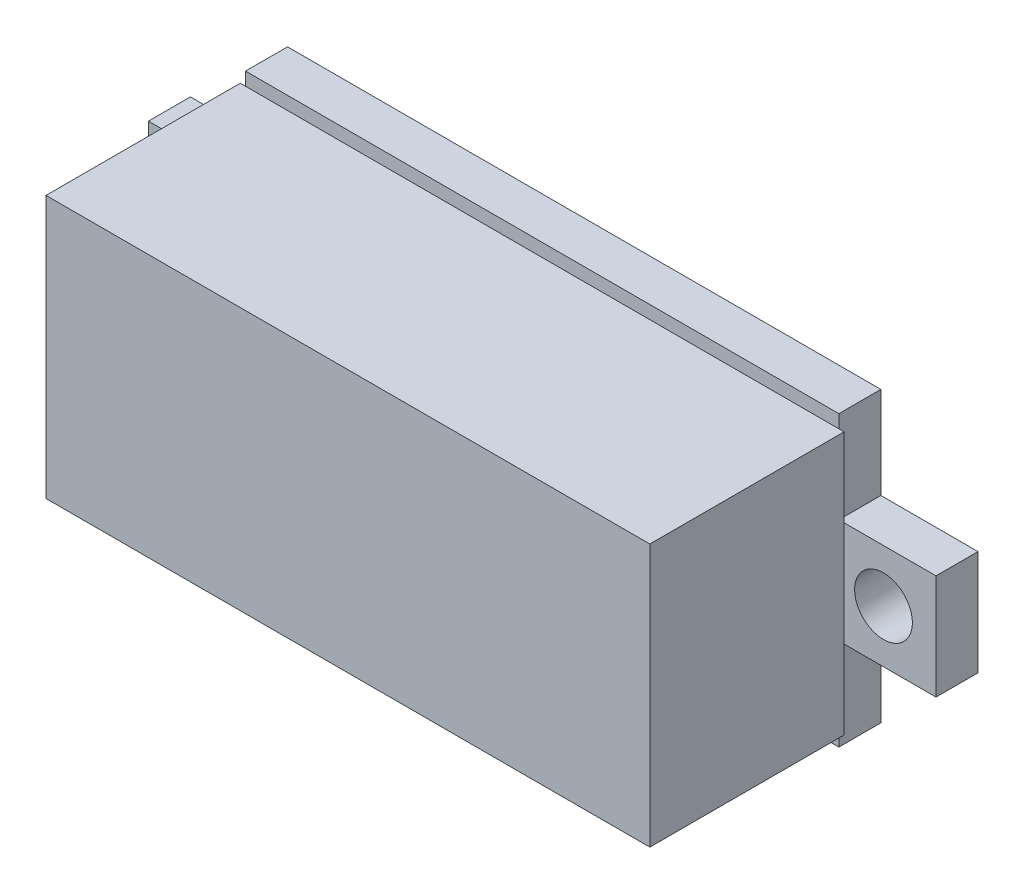
ISO-10303-21;
HEADER;
FILE_DESCRIPTION(('STEP AP214'),'2;1');
FILE_NAME('part.step','',(''),(''),'','','');
FILE_SCHEMA(('AUTOMOTIVE_DESIGN { 1 0 10303 214 1 1 1 1 }'));
ENDSEC;
DATA;
#1=APPLICATION_CONTEXT('core data for automotive mechanical design processes');
#2=APPLICATION_PROTOCOL_DEFINITION('international standard','automotive_design',2000,#1);
#3=PRODUCT_CONTEXT('',#1,'mechanical');
#4=PRODUCT('Part','Part','',(#3));
#5=PRODUCT_RELATED_PRODUCT_CATEGORY('part','',(#4));
#6=PRODUCT_DEFINITION_FORMATION('','',#4);
#7=PRODUCT_DEFINITION_CONTEXT('part definition',#1,'design');
#8=PRODUCT_DEFINITION('design','',#6,#7);
#9=PRODUCT_DEFINITION_SHAPE('','',#8);
#10=(LENGTH_UNIT() NAMED_UNIT(*) SI_UNIT(.MILLI.,.METRE.));
#11=(NAMED_UNIT(*) PLANE_ANGLE_UNIT() SI_UNIT($,.RADIAN.));
#12=(NAMED_UNIT(*) SI_UNIT($,.STERADIAN.) SOLID_ANGLE_UNIT());
#13=UNCERTAINTY_MEASURE_WITH_UNIT(LENGTH_MEASURE(1.E-05),#10,'distance_accuracy_value','');
#14=(GEOMETRIC_REPRESENTATION_CONTEXT(3) GLOBAL_UNCERTAINTY_ASSIGNED_CONTEXT((#13)) GLOBAL_UNIT_ASSIGNED_CONTEXT((#10,
#11,#12)) REPRESENTATION_CONTEXT('',''));
#15=CARTESIAN_POINT('',(0.,0.,0.));
#16=DIRECTION('',(0.,0.,1.));
#17=DIRECTION('',(1.,0.,0.));
#18=AXIS2_PLACEMENT_3D('',#15,#16,#17);
#19=CARTESIAN_POINT('',(0.,0.,0.));
#20=DIRECTION('',(0.,0.,1.));
#21=DIRECTION('',(1.,0.,0.));
#22=AXIS2_PLACEMENT_3D('',#19,#20,#21);
#23=PLANE('',#22);
#24=DIRECTION('',(0.,-1.,0.));
#25=VECTOR('',#24,1.);
#26=CARTESIAN_POINT('',(11.3,-2.,0.));
#27=LINE('',#26,#25);
#28=CARTESIAN_POINT('',(11.3,-2.,0.));
#29=VERTEX_POINT('',#28);
#30=CARTESIAN_POINT('',(11.3,-5.,0.));
#31=VERTEX_POINT('',#30);
#32=EDGE_CURVE('E58',#29,#31,#27,.T.);
#33=ORIENTED_EDGE('',*,*,#32,.F.);
#34=DIRECTION('',(-1.,0.,0.));
#35=VECTOR('',#34,1.);
#36=CARTESIAN_POINT('',(11.3,-2.,0.));
#37=LINE('',#36,#35);
#38=CARTESIAN_POINT('',(11.5,-2.,0.));
#39=VERTEX_POINT('',#38);
#40=EDGE_CURVE('E11',#39,#29,#37,.T.);
#41=ORIENTED_EDGE('',*,*,#40,.F.);
#42=DIRECTION('',(0.,1.,0.));
#43=VECTOR('',#42,1.);
#44=CARTESIAN_POINT('',(11.5,5.,0.));
#45=LINE('',#44,#43);
#46=CARTESIAN_POINT('',(11.5,-5.,0.));
#47=VERTEX_POINT('',#46);
#48=EDGE_CURVE('E215',#47,#39,#45,.T.);
#49=ORIENTED_EDGE('',*,*,#48,.F.);
#50=DIRECTION('',(1.,0.,0.));
#51=VECTOR('',#50,1.);
#52=CARTESIAN_POINT('',(-11.5,-5.,0.));
#53=LINE('',#52,#51);
#54=EDGE_CURVE('E248',#31,#47,#53,.T.);
#55=ORIENTED_EDGE('',*,*,#54,.F.);
#56=EDGE_LOOP('',(#33,#41,#49,#55));
#57=FACE_BOUND('',#56,.T.);
#58=ADVANCED_FACE('F39',(#57),#23,.F.);
#59=DIRECTION('',(1.,0.,0.));
#60=VECTOR('',#59,1.);
#61=CARTESIAN_POINT('',(11.3,2.,0.));
#62=LINE('',#61,#60);
#63=CARTESIAN_POINT('',(11.3,2.,0.));
#64=VERTEX_POINT('',#63);
#65=CARTESIAN_POINT('',(11.5,2.,0.));
#66=VERTEX_POINT('',#65);
#67=EDGE_CURVE('E65',#64,#66,#62,.T.);
#68=ORIENTED_EDGE('',*,*,#67,.F.);
#69=DIRECTION('',(0.,-1.,0.));
#70=VECTOR('',#69,1.);
#71=CARTESIAN_POINT('',(11.3,5.5,0.));
#72=LINE('',#71,#70);
#73=CARTESIAN_POINT('',(11.3,5.,0.));
#74=VERTEX_POINT('',#73);
#75=EDGE_CURVE('E49',#74,#64,#72,.T.);
#76=ORIENTED_EDGE('',*,*,#75,.F.);
#77=DIRECTION('',(-1.,0.,0.));
#78=VECTOR('',#77,1.);
#79=CARTESIAN_POINT('',(-11.5,5.,0.));
#80=LINE('',#79,#78);
#81=CARTESIAN_POINT('',(11.5,5.,0.));
#82=VERTEX_POINT('',#81);
#83=EDGE_CURVE('E238',#82,#74,#80,.T.);
#84=ORIENTED_EDGE('',*,*,#83,.F.);
#85=EDGE_CURVE('E209',#66,#82,#45,.T.);
#86=ORIENTED_EDGE('',*,*,#85,.F.);
#87=EDGE_LOOP('',(#68,#76,#84,#86));
#88=FACE_BOUND('',#87,.T.);
#89=ADVANCED_FACE('F487',(#88),#23,.F.);
#90=DIRECTION('',(0.,1.,0.));
#91=VECTOR('',#90,1.);
#92=CARTESIAN_POINT('',(-11.3,5.5,0.));
#93=LINE('',#92,#91);
#94=CARTESIAN_POINT('',(-11.3,2.,0.));
#95=VERTEX_POINT('',#94);
#96=CARTESIAN_POINT('',(-11.3,5.,0.));
#97=VERTEX_POINT('',#96);
#98=EDGE_CURVE('E385',#95,#97,#93,.T.);
#99=ORIENTED_EDGE('',*,*,#98,.F.);
#100=DIRECTION('',(1.,0.,0.));
#101=VECTOR('',#100,1.);
#102=CARTESIAN_POINT('',(-15.,2.,0.));
#103=LINE('',#102,#101);
#104=CARTESIAN_POINT('',(-11.5,2.,0.));
#105=VERTEX_POINT('',#104);
#106=EDGE_CURVE('E272',#105,#95,#103,.T.);
#107=ORIENTED_EDGE('',*,*,#106,.F.);
#108=DIRECTION('',(0.,-1.,0.));
#109=VECTOR('',#108,1.);
#110=CARTESIAN_POINT('',(-11.5,5.,0.));
#111=LINE('',#110,#109);
#112=CARTESIAN_POINT('',(-11.5,5.,0.));
#113=VERTEX_POINT('',#112);
#114=EDGE_CURVE('E244',#113,#105,#111,.T.);
#115=ORIENTED_EDGE('',*,*,#114,.F.);
#116=EDGE_CURVE('E237',#97,#113,#80,.T.);
#117=ORIENTED_EDGE('',*,*,#116,.F.);
#118=EDGE_LOOP('',(#99,#107,#115,#117));
#119=FACE_BOUND('',#118,.T.);
#120=ADVANCED_FACE('F492',(#119),#23,.F.);
#121=DIRECTION('',(0.,1.,0.));
#122=VECTOR('',#121,1.);
#123=CARTESIAN_POINT('',(-11.3,-1.99999999999999,0.));
#124=LINE('',#123,#122);
#125=CARTESIAN_POINT('',(-11.3,-5.,0.));
#126=VERTEX_POINT('',#125);
#127=CARTESIAN_POINT('',(-11.3,-1.99999999999999,0.));
#128=VERTEX_POINT('',#127);
#129=EDGE_CURVE('E207',#126,#128,#124,.T.);
#130=ORIENTED_EDGE('',*,*,#129,.F.);
#131=CARTESIAN_POINT('',(-11.5,-5.,0.));
#132=VERTEX_POINT('',#131);
#133=EDGE_CURVE('E225',#132,#126,#53,.T.);
#134=ORIENTED_EDGE('',*,*,#133,.F.);
#135=CARTESIAN_POINT('',(-11.5,-1.99999999999999,0.));
#136=VERTEX_POINT('',#135);
#137=EDGE_CURVE('E242',#136,#132,#111,.T.);
#138=ORIENTED_EDGE('',*,*,#137,.F.);
#139=DIRECTION('',(-1.,0.,0.));
#140=VECTOR('',#139,1.);
#141=CARTESIAN_POINT('',(-15.,-2.,0.));
#142=LINE('',#141,#140);
#143=EDGE_CURVE('E287',#128,#136,#142,.T.);
#144=ORIENTED_EDGE('',*,*,#143,.F.);
#145=EDGE_LOOP('',(#130,#134,#138,#144));
#146=FACE_BOUND('',#145,.T.);
#147=ADVANCED_FACE('F456',(#146),#23,.F.);
#148=CARTESIAN_POINT('',(11.5,5.,7.4));
#149=DIRECTION('',(-1.,0.,0.));
#150=DIRECTION('',(0.,-1.,0.));
#151=AXIS2_PLACEMENT_3D('',#148,#149,#150);
#152=PLANE('',#151);
#153=ORIENTED_EDGE('',*,*,#48,.T.);
#154=EDGE_CURVE('E213',#39,#66,#45,.T.);
#155=ORIENTED_EDGE('',*,*,#154,.T.);
#156=ORIENTED_EDGE('',*,*,#85,.T.);
#157=DIRECTION('',(0.,0.,-1.));
#158=VECTOR('',#157,1.);
#159=CARTESIAN_POINT('',(11.5,5.,7.4));
#160=LINE('',#159,#158);
#161=CARTESIAN_POINT('',(11.5,5.,7.4));
#162=VERTEX_POINT('',#161);
#163=EDGE_CURVE('E43',#162,#82,#160,.T.);
#164=ORIENTED_EDGE('',*,*,#163,.F.);
#165=DIRECTION('',(0.,1.,0.));
#166=VECTOR('',#165,1.);
#167=CARTESIAN_POINT('',(11.5,5.,7.4));
#168=LINE('',#167,#166);
#169=CARTESIAN_POINT('',(11.5,-5.,7.4));
#170=VERTEX_POINT('',#169);
#171=EDGE_CURVE('E220',#170,#162,#168,.T.);
#172=ORIENTED_EDGE('',*,*,#171,.F.);
#173=DIRECTION('',(0.,0.,-1.));
#174=VECTOR('',#173,1.);
#175=CARTESIAN_POINT('',(11.5,-5.,7.4));
#176=LINE('',#175,#174);
#177=EDGE_CURVE('E233',#170,#47,#176,.T.);
#178=ORIENTED_EDGE('',*,*,#177,.T.);
#179=EDGE_LOOP('',(#153,#155,#156,#164,#172,#178));
#180=FACE_BOUND('',#179,.T.);
#181=ADVANCED_FACE('F41',(#180),#152,.F.);
#182=CARTESIAN_POINT('',(-11.5,5.,7.4));
#183=DIRECTION('',(0.,-1.,0.));
#184=DIRECTION('',(0.,0.,-1.));
#185=AXIS2_PLACEMENT_3D('',#182,#183,#184);
#186=PLANE('',#185);
#187=ORIENTED_EDGE('',*,*,#83,.T.);
#188=EDGE_CURVE('E243',#74,#97,#80,.T.);
#189=ORIENTED_EDGE('',*,*,#188,.T.);
#190=ORIENTED_EDGE('',*,*,#116,.T.);
#191=DIRECTION('',(0.,0.,-1.));
#192=VECTOR('',#191,1.);
#193=CARTESIAN_POINT('',(-11.5,5.,7.4));
#194=LINE('',#193,#192);
#195=CARTESIAN_POINT('',(-11.5,5.,7.4));
#196=VERTEX_POINT('',#195);
#197=EDGE_CURVE('E260',#196,#113,#194,.T.);
#198=ORIENTED_EDGE('',*,*,#197,.F.);
#199=DIRECTION('',(-1.,0.,0.));
#200=VECTOR('',#199,1.);
#201=CARTESIAN_POINT('',(-11.5,5.,7.4));
#202=LINE('',#201,#200);
#203=EDGE_CURVE('E224',#162,#196,#202,.T.);
#204=ORIENTED_EDGE('',*,*,#203,.F.);
#205=ORIENTED_EDGE('',*,*,#163,.T.);
#206=EDGE_LOOP('',(#187,#189,#190,#198,#204,#205));
#207=FACE_BOUND('',#206,.T.);
#208=ADVANCED_FACE('F500',(#207),#186,.F.);
#209=CARTESIAN_POINT('',(-11.5,5.,7.4));
#210=DIRECTION('',(1.,0.,0.));
#211=DIRECTION('',(0.,1.,0.));
#212=AXIS2_PLACEMENT_3D('',#209,#210,#211);
#213=PLANE('',#212);
#214=ORIENTED_EDGE('',*,*,#114,.T.);
#215=EDGE_CURVE('E249',#105,#136,#111,.T.);
#216=ORIENTED_EDGE('',*,*,#215,.T.);
#217=ORIENTED_EDGE('',*,*,#137,.T.);
#218=DIRECTION('',(0.,0.,-1.));
#219=VECTOR('',#218,1.);
#220=CARTESIAN_POINT('',(-11.5,-5.,7.4));
#221=LINE('',#220,#219);
#222=CARTESIAN_POINT('',(-11.5,-5.,7.4));
#223=VERTEX_POINT('',#222);
#224=EDGE_CURVE('E257',#223,#132,#221,.T.);
#225=ORIENTED_EDGE('',*,*,#224,.F.);
#226=DIRECTION('',(0.,-1.,0.));
#227=VECTOR('',#226,1.);
#228=CARTESIAN_POINT('',(-11.5,5.,7.4));
#229=LINE('',#228,#227);
#230=EDGE_CURVE('E228',#196,#223,#229,.T.);
#231=ORIENTED_EDGE('',*,*,#230,.F.);
#232=ORIENTED_EDGE('',*,*,#197,.T.);
#233=EDGE_LOOP('',(#214,#216,#217,#225,#231,#232));
#234=FACE_BOUND('',#233,.T.);
#235=ADVANCED_FACE('F452',(#234),#213,.F.);
#236=CARTESIAN_POINT('',(-11.5,-5.,7.4));
#237=DIRECTION('',(0.,1.,0.));
#238=DIRECTION('',(0.,0.,1.));
#239=AXIS2_PLACEMENT_3D('',#236,#237,#238);
#240=PLANE('',#239);
#241=ORIENTED_EDGE('',*,*,#133,.T.);
#242=EDGE_CURVE('E253',#126,#31,#53,.T.);
#243=ORIENTED_EDGE('',*,*,#242,.T.);
#244=ORIENTED_EDGE('',*,*,#54,.T.);
#245=ORIENTED_EDGE('',*,*,#177,.F.);
#246=DIRECTION('',(1.,0.,0.));
#247=VECTOR('',#246,1.);
#248=CARTESIAN_POINT('',(-11.5,-5.,7.4));
#249=LINE('',#248,#247);
#250=EDGE_CURVE('E231',#223,#170,#249,.T.);
#251=ORIENTED_EDGE('',*,*,#250,.F.);
#252=ORIENTED_EDGE('',*,*,#224,.T.);
#253=EDGE_LOOP('',(#241,#243,#244,#245,#251,#252));
#254=FACE_BOUND('',#253,.T.);
#255=ADVANCED_FACE('F425',(#254),#240,.F.);
#256=CARTESIAN_POINT('',(0.,0.,7.4));
#257=DIRECTION('',(0.,0.,1.));
#258=DIRECTION('',(1.,0.,0.));
#259=AXIS2_PLACEMENT_3D('',#256,#257,#258);
#260=PLANE('',#259);
#261=ORIENTED_EDGE('',*,*,#171,.T.);
#262=ORIENTED_EDGE('',*,*,#203,.T.);
#263=ORIENTED_EDGE('',*,*,#230,.T.);
#264=ORIENTED_EDGE('',*,*,#250,.T.);
#265=EDGE_LOOP('',(#261,#262,#263,#264));
#266=FACE_BOUND('',#265,.T.);
#267=ADVANCED_FACE('F520',(#266),#260,.T.);
#268=CARTESIAN_POINT('',(0.,0.,0.));
#269=DIRECTION('',(0.,0.,-1.));
#270=DIRECTION('',(-1.,0.,0.));
#271=AXIS2_PLACEMENT_3D('',#268,#269,#270);
#272=PLANE('',#271);
#273=ORIENTED_EDGE('',*,*,#154,.F.);
#274=CARTESIAN_POINT('',(15.,-2.,0.));
#275=VERTEX_POINT('',#274);
#276=EDGE_CURVE('E51',#275,#39,#37,.T.);
#277=ORIENTED_EDGE('',*,*,#276,.F.);
#278=DIRECTION('',(0.,-1.,0.));
#279=VECTOR('',#278,1.);
#280=CARTESIAN_POINT('',(15.,-2.,0.));
#281=LINE('',#280,#279);
#282=CARTESIAN_POINT('',(15.,2.,0.));
#283=VERTEX_POINT('',#282);
#284=EDGE_CURVE('E401',#283,#275,#281,.T.);
#285=ORIENTED_EDGE('',*,*,#284,.F.);
#286=EDGE_CURVE('E398',#66,#283,#62,.T.);
#287=ORIENTED_EDGE('',*,*,#286,.F.);
#288=EDGE_LOOP('',(#273,#277,#285,#287));
#289=FACE_BOUND('',#288,.T.);
#290=CARTESIAN_POINT('',(13.,0.,0.));
#291=DIRECTION('',(0.,0.,-1.));
#292=DIRECTION('',(-1.,0.,0.));
#293=AXIS2_PLACEMENT_3D('',#290,#291,#292);
#294=CIRCLE('',#293,1.1);
#295=CARTESIAN_POINT('',(11.9,0.,0.));
#296=VERTEX_POINT('',#295);
#297=EDGE_CURVE('E289',#296,#296,#294,.T.);
#298=ORIENTED_EDGE('',*,*,#297,.T.);
#299=EDGE_LOOP('',(#298));
#300=FACE_BOUND('',#299,.T.);
#301=ADVANCED_FACE('F442',(#289,#300),#272,.F.);
#302=ORIENTED_EDGE('',*,*,#242,.F.);
#303=CARTESIAN_POINT('',(-11.3,-5.5,0.));
#304=VERTEX_POINT('',#303);
#305=EDGE_CURVE('E274',#304,#126,#124,.T.);
#306=ORIENTED_EDGE('',*,*,#305,.F.);
#307=DIRECTION('',(-1.,0.,0.));
#308=VECTOR('',#307,1.);
#309=CARTESIAN_POINT('',(11.3,-5.5,0.));
#310=LINE('',#309,#308);
#311=CARTESIAN_POINT('',(11.3,-5.5,0.));
#312=VERTEX_POINT('',#311);
#313=EDGE_CURVE('E202',#312,#304,#310,.T.);
#314=ORIENTED_EDGE('',*,*,#313,.F.);
#315=EDGE_CURVE('E405',#31,#312,#27,.T.);
#316=ORIENTED_EDGE('',*,*,#315,.F.);
#317=EDGE_LOOP('',(#302,#306,#314,#316));
#318=FACE_BOUND('',#317,.T.);
#319=ADVANCED_FACE('F419',(#318),#272,.F.);
#320=ORIENTED_EDGE('',*,*,#215,.F.);
#321=CARTESIAN_POINT('',(-15.,2.,0.));
#322=VERTEX_POINT('',#321);
#323=EDGE_CURVE('E278',#322,#105,#103,.T.);
#324=ORIENTED_EDGE('',*,*,#323,.F.);
#325=DIRECTION('',(0.,1.,0.));
#326=VECTOR('',#325,1.);
#327=CARTESIAN_POINT('',(-15.,-2.,0.));
#328=LINE('',#327,#326);
#329=CARTESIAN_POINT('',(-15.,-2.,0.));
#330=VERTEX_POINT('',#329);
#331=EDGE_CURVE('E380',#330,#322,#328,.T.);
#332=ORIENTED_EDGE('',*,*,#331,.F.);
#333=EDGE_CURVE('E282',#136,#330,#142,.T.);
#334=ORIENTED_EDGE('',*,*,#333,.F.);
#335=EDGE_LOOP('',(#320,#324,#332,#334));
#336=FACE_BOUND('',#335,.T.);
#337=CARTESIAN_POINT('',(-13.,0.,0.));
#338=DIRECTION('',(0.,0.,-1.));
#339=DIRECTION('',(-1.,0.,0.));
#340=AXIS2_PLACEMENT_3D('',#337,#338,#339);
#341=CIRCLE('',#340,1.1);
#342=CARTESIAN_POINT('',(-14.1,0.,0.));
#343=VERTEX_POINT('',#342);
#344=EDGE_CURVE('E298',#343,#343,#341,.T.);
#345=ORIENTED_EDGE('',*,*,#344,.T.);
#346=EDGE_LOOP('',(#345));
#347=FACE_BOUND('',#346,.T.);
#348=ADVANCED_FACE('F377',(#336,#347),#272,.F.);
#349=CARTESIAN_POINT('',(0.,0.,-1.6));
#350=DIRECTION('',(0.,0.,-1.));
#351=DIRECTION('',(-1.,0.,0.));
#352=AXIS2_PLACEMENT_3D('',#349,#350,#351);
#353=PLANE('',#352);
#354=CARTESIAN_POINT('',(13.,0.,-1.6));
#355=DIRECTION('',(0.,0.,-1.));
#356=DIRECTION('',(-1.,0.,0.));
#357=AXIS2_PLACEMENT_3D('',#354,#355,#356);
#358=CIRCLE('',#357,1.1);
#359=CARTESIAN_POINT('',(11.9,0.,-1.6));
#360=VERTEX_POINT('',#359);
#361=EDGE_CURVE('E283',#360,#360,#358,.T.);
#362=ORIENTED_EDGE('',*,*,#361,.F.);
#363=EDGE_LOOP('',(#362));
#364=FACE_BOUND('',#363,.T.);
#365=DIRECTION('',(0.,1.,0.));
#366=VECTOR('',#365,1.);
#367=CARTESIAN_POINT('',(-11.3,-1.99999999999999,-1.6));
#368=LINE('',#367,#366);
#369=CARTESIAN_POINT('',(-11.3,-5.5,-1.6));
#370=VERTEX_POINT('',#369);
#371=CARTESIAN_POINT('',(-11.3,-1.99999999999999,-1.6));
#372=VERTEX_POINT('',#371);
#373=EDGE_CURVE('E191',#370,#372,#368,.T.);
#374=ORIENTED_EDGE('',*,*,#373,.T.);
#375=DIRECTION('',(-1.,0.,0.));
#376=VECTOR('',#375,1.);
#377=CARTESIAN_POINT('',(-15.,-2.,-1.6));
#378=LINE('',#377,#376);
#379=CARTESIAN_POINT('',(-15.,-2.,-1.6));
#380=VERTEX_POINT('',#379);
#381=EDGE_CURVE('E179',#372,#380,#378,.T.);
#382=ORIENTED_EDGE('',*,*,#381,.T.);
#383=DIRECTION('',(0.,1.,0.));
#384=VECTOR('',#383,1.);
#385=CARTESIAN_POINT('',(-15.,-2.,-1.6));
#386=LINE('',#385,#384);
#387=CARTESIAN_POINT('',(-15.,2.,-1.6));
#388=VERTEX_POINT('',#387);
#389=EDGE_CURVE('E190',#380,#388,#386,.T.);
#390=ORIENTED_EDGE('',*,*,#389,.T.);
#391=DIRECTION('',(1.,0.,0.));
#392=VECTOR('',#391,1.);
#393=CARTESIAN_POINT('',(-15.,2.,-1.6));
#394=LINE('',#393,#392);
#395=CARTESIAN_POINT('',(-11.3,2.,-1.6));
#396=VERTEX_POINT('',#395);
#397=EDGE_CURVE('E303',#388,#396,#394,.T.);
#398=ORIENTED_EDGE('',*,*,#397,.T.);
#399=DIRECTION('',(0.,1.,0.));
#400=VECTOR('',#399,1.);
#401=CARTESIAN_POINT('',(-11.3,5.5,-1.6));
#402=LINE('',#401,#400);
#403=CARTESIAN_POINT('',(-11.3,5.5,-1.6));
#404=VERTEX_POINT('',#403);
#405=EDGE_CURVE('E306',#396,#404,#402,.T.);
#406=ORIENTED_EDGE('',*,*,#405,.T.);
#407=DIRECTION('',(1.,0.,0.));
#408=VECTOR('',#407,1.);
#409=CARTESIAN_POINT('',(11.3,5.5,-1.6));
#410=LINE('',#409,#408);
#411=CARTESIAN_POINT('',(11.3,5.5,-1.6));
#412=VERTEX_POINT('',#411);
#413=EDGE_CURVE('E309',#404,#412,#410,.T.);
#414=ORIENTED_EDGE('',*,*,#413,.T.);
#415=DIRECTION('',(0.,-1.,0.));
#416=VECTOR('',#415,1.);
#417=CARTESIAN_POINT('',(11.3,5.5,-1.6));
#418=LINE('',#417,#416);
#419=CARTESIAN_POINT('',(11.3,2.,-1.6));
#420=VERTEX_POINT('',#419);
#421=EDGE_CURVE('E312',#412,#420,#418,.T.);
#422=ORIENTED_EDGE('',*,*,#421,.T.);
#423=DIRECTION('',(1.,0.,0.));
#424=VECTOR('',#423,1.);
#425=CARTESIAN_POINT('',(11.3,2.,-1.6));
#426=LINE('',#425,#424);
#427=CARTESIAN_POINT('',(15.,2.,-1.6));
#428=VERTEX_POINT('',#427);
#429=EDGE_CURVE('E315',#420,#428,#426,.T.);
#430=ORIENTED_EDGE('',*,*,#429,.T.);
#431=DIRECTION('',(0.,-1.,0.));
#432=VECTOR('',#431,1.);
#433=CARTESIAN_POINT('',(15.,-2.,-1.6));
#434=LINE('',#433,#432);
#435=CARTESIAN_POINT('',(15.,-2.,-1.6));
#436=VERTEX_POINT('',#435);
#437=EDGE_CURVE('E318',#428,#436,#434,.T.);
#438=ORIENTED_EDGE('',*,*,#437,.T.);
#439=DIRECTION('',(-1.,0.,0.));
#440=VECTOR('',#439,1.);
#441=CARTESIAN_POINT('',(11.3,-2.,-1.6));
#442=LINE('',#441,#440);
#443=CARTESIAN_POINT('',(11.3,-2.,-1.6));
#444=VERTEX_POINT('',#443);
#445=EDGE_CURVE('E321',#436,#444,#442,.T.);
#446=ORIENTED_EDGE('',*,*,#445,.T.);
#447=DIRECTION('',(0.,-1.,0.));
#448=VECTOR('',#447,1.);
#449=CARTESIAN_POINT('',(11.3,-2.,-1.6));
#450=LINE('',#449,#448);
#451=CARTESIAN_POINT('',(11.3,-5.5,-1.6));
#452=VERTEX_POINT('',#451);
#453=EDGE_CURVE('E324',#444,#452,#450,.T.);
#454=ORIENTED_EDGE('',*,*,#453,.T.);
#455=DIRECTION('',(-1.,0.,0.));
#456=VECTOR('',#455,1.);
#457=CARTESIAN_POINT('',(11.3,-5.5,-1.6));
#458=LINE('',#457,#456);
#459=EDGE_CURVE('E197',#452,#370,#458,.T.);
#460=ORIENTED_EDGE('',*,*,#459,.T.);
#461=EDGE_LOOP('',(#374,#382,#390,#398,#406,#414,#422,#430,#438,#446,#454,#460));
#462=FACE_BOUND('',#461,.T.);
#463=CARTESIAN_POINT('',(-13.,0.,-1.6));
#464=DIRECTION('',(0.,0.,-1.));
#465=DIRECTION('',(-1.,0.,0.));
#466=AXIS2_PLACEMENT_3D('',#463,#464,#465);
#467=CIRCLE('',#466,1.1);
#468=CARTESIAN_POINT('',(-14.1,0.,-1.6));
#469=VERTEX_POINT('',#468);
#470=EDGE_CURVE('E295',#469,#469,#467,.T.);
#471=ORIENTED_EDGE('',*,*,#470,.F.);
#472=EDGE_LOOP('',(#471));
#473=FACE_BOUND('',#472,.T.);
#474=ADVANCED_FACE('F194',(#364,#462,#473),#353,.T.);
#475=ORIENTED_EDGE('',*,*,#188,.F.);
#476=CARTESIAN_POINT('',(11.3,5.5,0.));
#477=VERTEX_POINT('',#476);
#478=EDGE_CURVE('E394',#477,#74,#72,.T.);
#479=ORIENTED_EDGE('',*,*,#478,.F.);
#480=DIRECTION('',(1.,0.,0.));
#481=VECTOR('',#480,1.);
#482=CARTESIAN_POINT('',(11.3,5.5,0.));
#483=LINE('',#482,#481);
#484=CARTESIAN_POINT('',(-11.3,5.5,0.));
#485=VERTEX_POINT('',#484);
#486=EDGE_CURVE('E391',#485,#477,#483,.T.);
#487=ORIENTED_EDGE('',*,*,#486,.F.);
#488=EDGE_CURVE('E382',#97,#485,#93,.T.);
#489=ORIENTED_EDGE('',*,*,#488,.F.);
#490=EDGE_LOOP('',(#475,#479,#487,#489));
#491=FACE_BOUND('',#490,.T.);
#492=ADVANCED_FACE('F508',(#491),#272,.F.);
#493=CARTESIAN_POINT('',(-11.3,-1.99999999999999,-1.6));
#494=DIRECTION('',(1.,0.,0.));
#495=DIRECTION('',(0.,0.,-1.));
#496=AXIS2_PLACEMENT_3D('',#493,#494,#495);
#497=PLANE('',#496);
#498=ORIENTED_EDGE('',*,*,#305,.T.);
#499=ORIENTED_EDGE('',*,*,#129,.T.);
#500=DIRECTION('',(0.,0.,1.));
#501=VECTOR('',#500,1.);
#502=CARTESIAN_POINT('',(-11.3,-1.99999999999999,-1.6));
#503=LINE('',#502,#501);
#504=EDGE_CURVE('E184',#372,#128,#503,.T.);
#505=ORIENTED_EDGE('',*,*,#504,.F.);
#506=ORIENTED_EDGE('',*,*,#373,.F.);
#507=DIRECTION('',(0.,0.,1.));
#508=VECTOR('',#507,1.);
#509=CARTESIAN_POINT('',(-11.3,-5.5,-1.6));
#510=LINE('',#509,#508);
#511=EDGE_CURVE('E327',#370,#304,#510,.T.);
#512=ORIENTED_EDGE('',*,*,#511,.T.);
#513=EDGE_LOOP('',(#498,#499,#505,#506,#512));
#514=FACE_BOUND('',#513,.T.);
#515=ADVANCED_FACE('F206',(#514),#497,.F.);
#516=CARTESIAN_POINT('',(-15.,-2.,-1.6));
#517=DIRECTION('',(0.,1.,0.));
#518=DIRECTION('',(-1.,0.,0.));
#519=AXIS2_PLACEMENT_3D('',#516,#517,#518);
#520=PLANE('',#519);
#521=ORIENTED_EDGE('',*,*,#143,.T.);
#522=ORIENTED_EDGE('',*,*,#333,.T.);
#523=DIRECTION('',(0.,0.,1.));
#524=VECTOR('',#523,1.);
#525=CARTESIAN_POINT('',(-15.,-2.,-1.6));
#526=LINE('',#525,#524);
#527=EDGE_CURVE('E186',#380,#330,#526,.T.);
#528=ORIENTED_EDGE('',*,*,#527,.F.);
#529=ORIENTED_EDGE('',*,*,#381,.F.);
#530=ORIENTED_EDGE('',*,*,#504,.T.);
#531=EDGE_LOOP('',(#521,#522,#528,#529,#530));
#532=FACE_BOUND('',#531,.T.);
#533=ADVANCED_FACE('F182',(#532),#520,.F.);
#534=CARTESIAN_POINT('',(-15.,-2.,-1.6));
#535=DIRECTION('',(1.,0.,0.));
#536=DIRECTION('',(0.,0.,-1.));
#537=AXIS2_PLACEMENT_3D('',#534,#535,#536);
#538=PLANE('',#537);
#539=ORIENTED_EDGE('',*,*,#331,.T.);
#540=DIRECTION('',(0.,0.,1.));
#541=VECTOR('',#540,1.);
#542=CARTESIAN_POINT('',(-15.,2.,-1.6));
#543=LINE('',#542,#541);
#544=EDGE_CURVE('E216',#388,#322,#543,.T.);
#545=ORIENTED_EDGE('',*,*,#544,.F.);
#546=ORIENTED_EDGE('',*,*,#389,.F.);
#547=ORIENTED_EDGE('',*,*,#527,.T.);
#548=EDGE_LOOP('',(#539,#545,#546,#547));
#549=FACE_BOUND('',#548,.T.);
#550=ADVANCED_FACE('F458',(#549),#538,.F.);
#551=CARTESIAN_POINT('',(-15.,2.,-1.6));
#552=DIRECTION('',(0.,-1.,0.));
#553=DIRECTION('',(1.,0.,0.));
#554=AXIS2_PLACEMENT_3D('',#551,#552,#553);
#555=PLANE('',#554);
#556=ORIENTED_EDGE('',*,*,#323,.T.);
#557=ORIENTED_EDGE('',*,*,#106,.T.);
#558=DIRECTION('',(0.,0.,1.));
#559=VECTOR('',#558,1.);
#560=CARTESIAN_POINT('',(-11.3,2.,-1.6));
#561=LINE('',#560,#559);
#562=EDGE_CURVE('E361',#396,#95,#561,.T.);
#563=ORIENTED_EDGE('',*,*,#562,.F.);
#564=ORIENTED_EDGE('',*,*,#397,.F.);
#565=ORIENTED_EDGE('',*,*,#544,.T.);
#566=EDGE_LOOP('',(#556,#557,#563,#564,#565));
#567=FACE_BOUND('',#566,.T.);
#568=ADVANCED_FACE('F371',(#567),#555,.F.);
#569=CARTESIAN_POINT('',(-11.3,5.5,-1.6));
#570=DIRECTION('',(1.,0.,0.));
#571=DIRECTION('',(0.,0.,-1.));
#572=AXIS2_PLACEMENT_3D('',#569,#570,#571);
#573=PLANE('',#572);
#574=ORIENTED_EDGE('',*,*,#98,.T.);
#575=ORIENTED_EDGE('',*,*,#488,.T.);
#576=DIRECTION('',(0.,0.,1.));
#577=VECTOR('',#576,1.);
#578=CARTESIAN_POINT('',(-11.3,5.5,-1.6));
#579=LINE('',#578,#577);
#580=EDGE_CURVE('E357',#404,#485,#579,.T.);
#581=ORIENTED_EDGE('',*,*,#580,.F.);
#582=ORIENTED_EDGE('',*,*,#405,.F.);
#583=ORIENTED_EDGE('',*,*,#562,.T.);
#584=EDGE_LOOP('',(#574,#575,#581,#582,#583));
#585=FACE_BOUND('',#584,.T.);
#586=ADVANCED_FACE('F462',(#585),#573,.F.);
#587=CARTESIAN_POINT('',(11.3,5.5,-1.6));
#588=DIRECTION('',(0.,-1.,0.));
#589=DIRECTION('',(0.,0.,-1.));
#590=AXIS2_PLACEMENT_3D('',#587,#588,#589);
#591=PLANE('',#590);
#592=ORIENTED_EDGE('',*,*,#486,.T.);
#593=DIRECTION('',(0.,0.,1.));
#594=VECTOR('',#593,1.);
#595=CARTESIAN_POINT('',(11.3,5.5,-1.6));
#596=LINE('',#595,#594);
#597=EDGE_CURVE('E353',#412,#477,#596,.T.);
#598=ORIENTED_EDGE('',*,*,#597,.F.);
#599=ORIENTED_EDGE('',*,*,#413,.F.);
#600=ORIENTED_EDGE('',*,*,#580,.T.);
#601=EDGE_LOOP('',(#592,#598,#599,#600));
#602=FACE_BOUND('',#601,.T.);
#603=ADVANCED_FACE('F468',(#602),#591,.F.);
#604=CARTESIAN_POINT('',(11.3,5.5,-1.6));
#605=DIRECTION('',(-1.,0.,0.));
#606=DIRECTION('',(0.,0.,1.));
#607=AXIS2_PLACEMENT_3D('',#604,#605,#606);
#608=PLANE('',#607);
#609=ORIENTED_EDGE('',*,*,#478,.T.);
#610=ORIENTED_EDGE('',*,*,#75,.T.);
#611=DIRECTION('',(0.,0.,1.));
#612=VECTOR('',#611,1.);
#613=CARTESIAN_POINT('',(11.3,2.,-1.6));
#614=LINE('',#613,#612);
#615=EDGE_CURVE('E349',#420,#64,#614,.T.);
#616=ORIENTED_EDGE('',*,*,#615,.F.);
#617=ORIENTED_EDGE('',*,*,#421,.F.);
#618=ORIENTED_EDGE('',*,*,#597,.T.);
#619=EDGE_LOOP('',(#609,#610,#616,#617,#618));
#620=FACE_BOUND('',#619,.T.);
#621=ADVANCED_FACE('F474',(#620),#608,.F.);
#622=CARTESIAN_POINT('',(11.3,2.,-1.6));
#623=DIRECTION('',(0.,-1.,0.));
#624=DIRECTION('',(1.,0.,0.));
#625=AXIS2_PLACEMENT_3D('',#622,#623,#624);
#626=PLANE('',#625);
#627=ORIENTED_EDGE('',*,*,#67,.T.);
#628=ORIENTED_EDGE('',*,*,#286,.T.);
#629=DIRECTION('',(0.,0.,1.));
#630=VECTOR('',#629,1.);
#631=CARTESIAN_POINT('',(15.,2.,-1.6));
#632=LINE('',#631,#630);
#633=EDGE_CURVE('E345',#428,#283,#632,.T.);
#634=ORIENTED_EDGE('',*,*,#633,.F.);
#635=ORIENTED_EDGE('',*,*,#429,.F.);
#636=ORIENTED_EDGE('',*,*,#615,.T.);
#637=EDGE_LOOP('',(#627,#628,#634,#635,#636));
#638=FACE_BOUND('',#637,.T.);
#639=ADVANCED_FACE('F476',(#638),#626,.F.);
#640=CARTESIAN_POINT('',(15.,-2.,-1.6));
#641=DIRECTION('',(-1.,0.,0.));
#642=DIRECTION('',(0.,0.,1.));
#643=AXIS2_PLACEMENT_3D('',#640,#641,#642);
#644=PLANE('',#643);
#645=ORIENTED_EDGE('',*,*,#284,.T.);
#646=DIRECTION('',(0.,0.,1.));
#647=VECTOR('',#646,1.);
#648=CARTESIAN_POINT('',(15.,-2.,-1.6));
#649=LINE('',#648,#647);
#650=EDGE_CURVE('E341',#436,#275,#649,.T.);
#651=ORIENTED_EDGE('',*,*,#650,.F.);
#652=ORIENTED_EDGE('',*,*,#437,.F.);
#653=ORIENTED_EDGE('',*,*,#633,.T.);
#654=EDGE_LOOP('',(#645,#651,#652,#653));
#655=FACE_BOUND('',#654,.T.);
#656=ADVANCED_FACE('F477',(#655),#644,.F.);
#657=CARTESIAN_POINT('',(11.3,-2.,-1.6));
#658=DIRECTION('',(0.,1.,0.));
#659=DIRECTION('',(0.,0.,1.));
#660=AXIS2_PLACEMENT_3D('',#657,#658,#659);
#661=PLANE('',#660);
#662=ORIENTED_EDGE('',*,*,#276,.T.);
#663=ORIENTED_EDGE('',*,*,#40,.T.);
#664=DIRECTION('',(0.,0.,1.));
#665=VECTOR('',#664,1.);
#666=CARTESIAN_POINT('',(11.3,-2.,-1.6));
#667=LINE('',#666,#665);
#668=EDGE_CURVE('E333',#444,#29,#667,.T.);
#669=ORIENTED_EDGE('',*,*,#668,.F.);
#670=ORIENTED_EDGE('',*,*,#445,.F.);
#671=ORIENTED_EDGE('',*,*,#650,.T.);
#672=EDGE_LOOP('',(#662,#663,#669,#670,#671));
#673=FACE_BOUND('',#672,.T.);
#674=ADVANCED_FACE('F434',(#673),#661,.F.);
#675=CARTESIAN_POINT('',(11.3,-2.,-1.6));
#676=DIRECTION('',(-1.,0.,0.));
#677=DIRECTION('',(0.,0.,1.));
#678=AXIS2_PLACEMENT_3D('',#675,#676,#677);
#679=PLANE('',#678);
#680=ORIENTED_EDGE('',*,*,#32,.T.);
#681=ORIENTED_EDGE('',*,*,#315,.T.);
#682=DIRECTION('',(0.,0.,1.));
#683=VECTOR('',#682,1.);
#684=CARTESIAN_POINT('',(11.3,-5.5,-1.6));
#685=LINE('',#684,#683);
#686=EDGE_CURVE('E329',#452,#312,#685,.T.);
#687=ORIENTED_EDGE('',*,*,#686,.F.);
#688=ORIENTED_EDGE('',*,*,#453,.F.);
#689=ORIENTED_EDGE('',*,*,#668,.T.);
#690=EDGE_LOOP('',(#680,#681,#687,#688,#689));
#691=FACE_BOUND('',#690,.T.);
#692=ADVANCED_FACE('F412',(#691),#679,.F.);
#693=CARTESIAN_POINT('',(11.3,-5.5,-1.6));
#694=DIRECTION('',(0.,1.,0.));
#695=DIRECTION('',(0.,0.,1.));
#696=AXIS2_PLACEMENT_3D('',#693,#694,#695);
#697=PLANE('',#696);
#698=ORIENTED_EDGE('',*,*,#313,.T.);
#699=ORIENTED_EDGE('',*,*,#511,.F.);
#700=ORIENTED_EDGE('',*,*,#459,.F.);
#701=ORIENTED_EDGE('',*,*,#686,.T.);
#702=EDGE_LOOP('',(#698,#699,#700,#701));
#703=FACE_BOUND('',#702,.T.);
#704=ADVANCED_FACE('F418',(#703),#697,.F.);
#705=CARTESIAN_POINT('',(13.,0.,-1.6));
#706=DIRECTION('',(0.,0.,1.));
#707=DIRECTION('',(1.,0.,0.));
#708=AXIS2_PLACEMENT_3D('',#705,#706,#707);
#709=CYLINDRICAL_SURFACE('',#708,1.1);
#710=ORIENTED_EDGE('',*,*,#361,.T.);
#711=EDGE_LOOP('',(#710));
#712=FACE_BOUND('',#711,.T.);
#713=ORIENTED_EDGE('',*,*,#297,.F.);
#714=EDGE_LOOP('',(#713));
#715=FACE_BOUND('',#714,.T.);
#716=ADVANCED_FACE('F670',(#712,#715),#709,.F.);
#717=CARTESIAN_POINT('',(-13.,0.,-1.6));
#718=DIRECTION('',(0.,0.,1.));
#719=DIRECTION('',(1.,0.,0.));
#720=AXIS2_PLACEMENT_3D('',#717,#718,#719);
#721=CYLINDRICAL_SURFACE('',#720,1.1);
#722=ORIENTED_EDGE('',*,*,#470,.T.);
#723=EDGE_LOOP('',(#722));
#724=FACE_BOUND('',#723,.T.);
#725=ORIENTED_EDGE('',*,*,#344,.F.);
#726=EDGE_LOOP('',(#725));
#727=FACE_BOUND('',#726,.T.);
#728=ADVANCED_FACE('F677',(#724,#727),#721,.F.);
#729=CLOSED_SHELL('',(#58,#89,#120,#147,#181,#208,#235,#255,#267,#301,#319,#348,#474,#492,#515,
#533,#550,#568,#586,#603,#621,#639,#656,#674,#692,#704,#716,#728));
#730=MANIFOLD_SOLID_BREP('B2',#729);
#731=ADVANCED_BREP_SHAPE_REPRESENTATION('',(#18,#730),#14);
#732=SHAPE_DEFINITION_REPRESENTATION(#9,#731);
ENDSEC;
END-ISO-10303-21;
